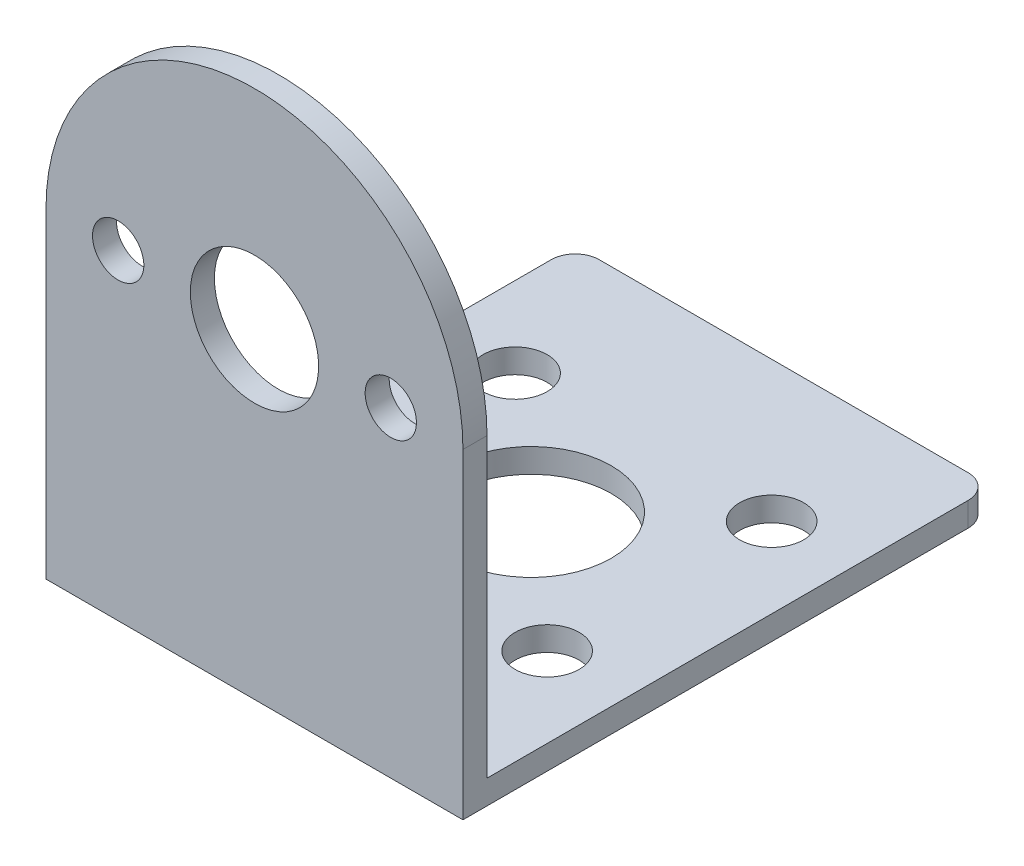
ISO-10303-21;
HEADER;
FILE_DESCRIPTION(('STEP AP214'),'2;1');
FILE_NAME('part.step','',(''),(''),'','','');
FILE_SCHEMA(('AUTOMOTIVE_DESIGN { 1 0 10303 214 1 1 1 1 }'));
ENDSEC;
DATA;
#1=APPLICATION_CONTEXT('core data for automotive mechanical design processes');
#2=APPLICATION_PROTOCOL_DEFINITION('international standard','automotive_design',2000,#1);
#3=PRODUCT_CONTEXT('',#1,'mechanical');
#4=PRODUCT('Part','Part','',(#3));
#5=PRODUCT_RELATED_PRODUCT_CATEGORY('part','',(#4));
#6=PRODUCT_DEFINITION_FORMATION('','',#4);
#7=PRODUCT_DEFINITION_CONTEXT('part definition',#1,'design');
#8=PRODUCT_DEFINITION('design','',#6,#7);
#9=PRODUCT_DEFINITION_SHAPE('','',#8);
#10=(LENGTH_UNIT() NAMED_UNIT(*) SI_UNIT(.MILLI.,.METRE.));
#11=(NAMED_UNIT(*) PLANE_ANGLE_UNIT() SI_UNIT($,.RADIAN.));
#12=(NAMED_UNIT(*) SI_UNIT($,.STERADIAN.) SOLID_ANGLE_UNIT());
#13=UNCERTAINTY_MEASURE_WITH_UNIT(LENGTH_MEASURE(1.E-05),#10,'distance_accuracy_value','');
#14=(GEOMETRIC_REPRESENTATION_CONTEXT(3) GLOBAL_UNCERTAINTY_ASSIGNED_CONTEXT((#13)) GLOBAL_UNIT_ASSIGNED_CONTEXT((#10,
#11,#12)) REPRESENTATION_CONTEXT('',''));
#15=CARTESIAN_POINT('',(0.,0.,0.));
#16=DIRECTION('',(0.,0.,1.));
#17=DIRECTION('',(1.,0.,0.));
#18=AXIS2_PLACEMENT_3D('',#15,#16,#17);
#19=CARTESIAN_POINT('',(13.,20.,0.));
#20=DIRECTION('',(0.,0.,1.));
#21=DIRECTION('',(1.,0.,0.));
#22=AXIS2_PLACEMENT_3D('',#19,#20,#21);
#23=PLANE('',#22);
#24=CARTESIAN_POINT('',(13.,20.,0.));
#25=DIRECTION('',(0.,0.,-1.));
#26=DIRECTION('',(-1.,0.,0.));
#27=AXIS2_PLACEMENT_3D('',#24,#25,#26);
#28=CIRCLE('',#27,4.);
#29=CARTESIAN_POINT('',(9.,20.,0.));
#30=VERTEX_POINT('',#29);
#31=EDGE_CURVE('E132',#30,#30,#28,.T.);
#32=ORIENTED_EDGE('',*,*,#31,.F.);
#33=EDGE_LOOP('',(#32));
#34=FACE_BOUND('',#33,.T.);
#35=CARTESIAN_POINT('',(4.5,20.,0.));
#36=DIRECTION('',(0.,0.,-1.));
#37=DIRECTION('',(-1.,0.,0.));
#38=AXIS2_PLACEMENT_3D('',#35,#36,#37);
#39=CIRCLE('',#38,1.6);
#40=CARTESIAN_POINT('',(2.9,20.,0.));
#41=VERTEX_POINT('',#40);
#42=EDGE_CURVE('E142',#41,#41,#39,.T.);
#43=ORIENTED_EDGE('',*,*,#42,.F.);
#44=EDGE_LOOP('',(#43));
#45=FACE_BOUND('',#44,.T.);
#46=CARTESIAN_POINT('',(21.5,20.,0.));
#47=DIRECTION('',(0.,0.,-1.));
#48=DIRECTION('',(-1.,0.,0.));
#49=AXIS2_PLACEMENT_3D('',#46,#47,#48);
#50=CIRCLE('',#49,1.6);
#51=CARTESIAN_POINT('',(19.9,20.,0.));
#52=VERTEX_POINT('',#51);
#53=EDGE_CURVE('E136',#52,#52,#50,.T.);
#54=ORIENTED_EDGE('',*,*,#53,.F.);
#55=EDGE_LOOP('',(#54));
#56=FACE_BOUND('',#55,.T.);
#57=DIRECTION('',(1.,0.,0.));
#58=VECTOR('',#57,1.);
#59=CARTESIAN_POINT('',(26.,1.5,0.));
#60=LINE('',#59,#58);
#61=CARTESIAN_POINT('',(0.,1.5,0.));
#62=VERTEX_POINT('',#61);
#63=CARTESIAN_POINT('',(26.,1.5,0.));
#64=VERTEX_POINT('',#63);
#65=EDGE_CURVE('E115',#62,#64,#60,.T.);
#66=ORIENTED_EDGE('',*,*,#65,.F.);
#67=DIRECTION('',(0.,-1.,0.));
#68=VECTOR('',#67,1.);
#69=CARTESIAN_POINT('',(0.,0.,0.));
#70=LINE('',#69,#68);
#71=CARTESIAN_POINT('',(0.,20.,0.));
#72=VERTEX_POINT('',#71);
#73=EDGE_CURVE('E118',#72,#62,#70,.T.);
#74=ORIENTED_EDGE('',*,*,#73,.F.);
#75=CARTESIAN_POINT('',(13.,20.,0.));
#76=DIRECTION('',(0.,0.,1.));
#77=DIRECTION('',(1.,0.,0.));
#78=AXIS2_PLACEMENT_3D('',#75,#76,#77);
#79=CIRCLE('',#78,13.);
#80=CARTESIAN_POINT('',(26.,20.,0.));
#81=VERTEX_POINT('',#80);
#82=EDGE_CURVE('E117',#81,#72,#79,.T.);
#83=ORIENTED_EDGE('',*,*,#82,.F.);
#84=DIRECTION('',(0.,1.,0.));
#85=VECTOR('',#84,1.);
#86=CARTESIAN_POINT('',(26.,0.,0.));
#87=LINE('',#86,#85);
#88=EDGE_CURVE('E104',#64,#81,#87,.T.);
#89=ORIENTED_EDGE('',*,*,#88,.F.);
#90=EDGE_LOOP('',(#66,#74,#83,#89));
#91=FACE_BOUND('',#90,.T.);
#92=ADVANCED_FACE('F38',(#34,#45,#56,#91),#23,.F.);
#93=CARTESIAN_POINT('',(0.,0.,1.5));
#94=DIRECTION('',(1.,0.,0.));
#95=DIRECTION('',(0.,0.,-1.));
#96=AXIS2_PLACEMENT_3D('',#93,#94,#95);
#97=PLANE('',#96);
#98=DIRECTION('',(0.,0.,1.));
#99=VECTOR('',#98,1.);
#100=CARTESIAN_POINT('',(0.,1.5,-31.5));
#101=LINE('',#100,#99);
#102=CARTESIAN_POINT('',(0.,1.5,-30.));
#103=VERTEX_POINT('',#102);
#104=EDGE_CURVE('E108',#103,#62,#101,.T.);
#105=ORIENTED_EDGE('',*,*,#104,.F.);
#106=DIRECTION('',(0.,1.,0.));
#107=VECTOR('',#106,1.);
#108=CARTESIAN_POINT('',(0.,0.,-30.));
#109=LINE('',#108,#107);
#110=CARTESIAN_POINT('',(0.,0.,-30.));
#111=VERTEX_POINT('',#110);
#112=EDGE_CURVE('E11',#103,#111,#109,.F.);
#113=ORIENTED_EDGE('',*,*,#112,.T.);
#114=DIRECTION('',(0.,0.,-1.));
#115=VECTOR('',#114,1.);
#116=CARTESIAN_POINT('',(0.,0.,1.5));
#117=LINE('',#116,#115);
#118=CARTESIAN_POINT('',(0.,0.,1.5));
#119=VERTEX_POINT('',#118);
#120=EDGE_CURVE('E168',#119,#111,#117,.T.);
#121=ORIENTED_EDGE('',*,*,#120,.F.);
#122=DIRECTION('',(0.,-1.,0.));
#123=VECTOR('',#122,1.);
#124=CARTESIAN_POINT('',(0.,0.,1.5));
#125=LINE('',#124,#123);
#126=CARTESIAN_POINT('',(0.,20.,1.5));
#127=VERTEX_POINT('',#126);
#128=EDGE_CURVE('E150',#127,#119,#125,.T.);
#129=ORIENTED_EDGE('',*,*,#128,.F.);
#130=DIRECTION('',(0.,0.,-1.));
#131=VECTOR('',#130,1.);
#132=CARTESIAN_POINT('',(0.,20.,1.5));
#133=LINE('',#132,#131);
#134=EDGE_CURVE('E159',#127,#72,#133,.T.);
#135=ORIENTED_EDGE('',*,*,#134,.T.);
#136=ORIENTED_EDGE('',*,*,#73,.T.);
#137=EDGE_LOOP('',(#105,#113,#121,#129,#135,#136));
#138=FACE_BOUND('',#137,.T.);
#139=ADVANCED_FACE('F216',(#138),#97,.F.);
#140=CARTESIAN_POINT('',(0.,0.,1.5));
#141=DIRECTION('',(0.,1.,0.));
#142=DIRECTION('',(0.,0.,1.));
#143=AXIS2_PLACEMENT_3D('',#140,#141,#142);
#144=PLANE('',#143);
#145=CARTESIAN_POINT('',(5.,0.,-22.75));
#146=DIRECTION('',(0.,-1.,0.));
#147=DIRECTION('',(0.,0.,1.));
#148=AXIS2_PLACEMENT_3D('',#145,#146,#147);
#149=CIRCLE('',#148,2.);
#150=CARTESIAN_POINT('',(5.,0.,-20.75));
#151=VERTEX_POINT('',#150);
#152=EDGE_CURVE('E296',#151,#151,#149,.T.);
#153=ORIENTED_EDGE('',*,*,#152,.F.);
#154=EDGE_LOOP('',(#153));
#155=FACE_BOUND('',#154,.T.);
#156=CARTESIAN_POINT('',(13.,0.,-15.75));
#157=DIRECTION('',(0.,-1.,0.));
#158=DIRECTION('',(0.,0.,-1.));
#159=AXIS2_PLACEMENT_3D('',#156,#157,#158);
#160=CIRCLE('',#159,5.);
#161=CARTESIAN_POINT('',(13.,0.,-20.75));
#162=VERTEX_POINT('',#161);
#163=EDGE_CURVE('E291',#162,#162,#160,.T.);
#164=ORIENTED_EDGE('',*,*,#163,.F.);
#165=EDGE_LOOP('',(#164));
#166=FACE_BOUND('',#165,.T.);
#167=CARTESIAN_POINT('',(21.,0.,-22.75));
#168=DIRECTION('',(0.,-1.,0.));
#169=DIRECTION('',(0.,0.,1.));
#170=AXIS2_PLACEMENT_3D('',#167,#168,#169);
#171=CIRCLE('',#170,2.);
#172=CARTESIAN_POINT('',(21.,0.,-20.75));
#173=VERTEX_POINT('',#172);
#174=EDGE_CURVE('E286',#173,#173,#171,.T.);
#175=ORIENTED_EDGE('',*,*,#174,.F.);
#176=EDGE_LOOP('',(#175));
#177=FACE_BOUND('',#176,.T.);
#178=CARTESIAN_POINT('',(21.,0.,-8.75));
#179=DIRECTION('',(0.,-1.,0.));
#180=DIRECTION('',(0.,0.,-1.));
#181=AXIS2_PLACEMENT_3D('',#178,#179,#180);
#182=CIRCLE('',#181,2.);
#183=CARTESIAN_POINT('',(21.,0.,-10.75));
#184=VERTEX_POINT('',#183);
#185=EDGE_CURVE('E279',#184,#184,#182,.T.);
#186=ORIENTED_EDGE('',*,*,#185,.F.);
#187=EDGE_LOOP('',(#186));
#188=FACE_BOUND('',#187,.T.);
#189=CARTESIAN_POINT('',(5.,0.,-8.75));
#190=DIRECTION('',(0.,-1.,0.));
#191=DIRECTION('',(0.,0.,-1.));
#192=AXIS2_PLACEMENT_3D('',#189,#190,#191);
#193=CIRCLE('',#192,2.);
#194=CARTESIAN_POINT('',(5.,0.,-10.75));
#195=VERTEX_POINT('',#194);
#196=EDGE_CURVE('E176',#195,#195,#193,.T.);
#197=ORIENTED_EDGE('',*,*,#196,.F.);
#198=EDGE_LOOP('',(#197));
#199=FACE_BOUND('',#198,.T.);
#200=DIRECTION('',(-1.,0.,0.));
#201=VECTOR('',#200,1.);
#202=CARTESIAN_POINT('',(26.,0.,-31.5));
#203=LINE('',#202,#201);
#204=CARTESIAN_POINT('',(24.5,0.,-31.5));
#205=VERTEX_POINT('',#204);
#206=CARTESIAN_POINT('',(1.5,0.,-31.5));
#207=VERTEX_POINT('',#206);
#208=EDGE_CURVE('E121',#205,#207,#203,.T.);
#209=ORIENTED_EDGE('',*,*,#208,.F.);
#210=CARTESIAN_POINT('',(24.5,0.,-30.));
#211=DIRECTION('',(0.,1.,0.));
#212=DIRECTION('',(0.,0.,1.));
#213=AXIS2_PLACEMENT_3D('',#210,#211,#212);
#214=CIRCLE('',#213,1.5);
#215=CARTESIAN_POINT('',(26.,0.,-30.));
#216=VERTEX_POINT('',#215);
#217=EDGE_CURVE('E191',#205,#216,#214,.F.);
#218=ORIENTED_EDGE('',*,*,#217,.T.);
#219=DIRECTION('',(0.,0.,-1.));
#220=VECTOR('',#219,1.);
#221=CARTESIAN_POINT('',(26.,0.,1.5));
#222=LINE('',#221,#220);
#223=CARTESIAN_POINT('',(26.,0.,1.5));
#224=VERTEX_POINT('',#223);
#225=EDGE_CURVE('E166',#224,#216,#222,.T.);
#226=ORIENTED_EDGE('',*,*,#225,.F.);
#227=DIRECTION('',(1.,0.,0.));
#228=VECTOR('',#227,1.);
#229=CARTESIAN_POINT('',(0.,0.,1.5));
#230=LINE('',#229,#228);
#231=EDGE_CURVE('E153',#119,#224,#230,.T.);
#232=ORIENTED_EDGE('',*,*,#231,.F.);
#233=ORIENTED_EDGE('',*,*,#120,.T.);
#234=CARTESIAN_POINT('',(1.5,0.,-30.));
#235=DIRECTION('',(0.,1.,0.));
#236=DIRECTION('',(0.,0.,1.));
#237=AXIS2_PLACEMENT_3D('',#234,#235,#236);
#238=CIRCLE('',#237,1.5);
#239=EDGE_CURVE('E189',#111,#207,#238,.F.);
#240=ORIENTED_EDGE('',*,*,#239,.T.);
#241=EDGE_LOOP('',(#209,#218,#226,#232,#233,#240));
#242=FACE_BOUND('',#241,.T.);
#243=ADVANCED_FACE('F204',(#155,#166,#177,#188,#199,#242),#144,.F.);
#244=CARTESIAN_POINT('',(26.,0.,1.5));
#245=DIRECTION('',(-1.,0.,0.));
#246=DIRECTION('',(0.,0.,1.));
#247=AXIS2_PLACEMENT_3D('',#244,#245,#246);
#248=PLANE('',#247);
#249=ORIENTED_EDGE('',*,*,#225,.T.);
#250=DIRECTION('',(0.,-1.,0.));
#251=VECTOR('',#250,1.);
#252=CARTESIAN_POINT('',(26.,0.,-30.));
#253=LINE('',#252,#251);
#254=CARTESIAN_POINT('',(26.,1.5,-30.));
#255=VERTEX_POINT('',#254);
#256=EDGE_CURVE('E61',#216,#255,#253,.F.);
#257=ORIENTED_EDGE('',*,*,#256,.T.);
#258=DIRECTION('',(0.,0.,1.));
#259=VECTOR('',#258,1.);
#260=CARTESIAN_POINT('',(26.,1.5,-31.5));
#261=LINE('',#260,#259);
#262=EDGE_CURVE('E100',#255,#64,#261,.T.);
#263=ORIENTED_EDGE('',*,*,#262,.T.);
#264=ORIENTED_EDGE('',*,*,#88,.T.);
#265=DIRECTION('',(0.,0.,-1.));
#266=VECTOR('',#265,1.);
#267=CARTESIAN_POINT('',(26.,20.,1.5));
#268=LINE('',#267,#266);
#269=CARTESIAN_POINT('',(26.,20.,1.5));
#270=VERTEX_POINT('',#269);
#271=EDGE_CURVE('E164',#270,#81,#268,.T.);
#272=ORIENTED_EDGE('',*,*,#271,.F.);
#273=DIRECTION('',(0.,1.,0.));
#274=VECTOR('',#273,1.);
#275=CARTESIAN_POINT('',(26.,0.,1.5));
#276=LINE('',#275,#274);
#277=EDGE_CURVE('E155',#224,#270,#276,.T.);
#278=ORIENTED_EDGE('',*,*,#277,.F.);
#279=EDGE_LOOP('',(#249,#257,#263,#264,#272,#278));
#280=FACE_BOUND('',#279,.T.);
#281=ADVANCED_FACE('F102',(#280),#248,.F.);
#282=CARTESIAN_POINT('',(13.,20.,1.5));
#283=DIRECTION('',(0.,0.,-1.));
#284=DIRECTION('',(-1.,0.,0.));
#285=AXIS2_PLACEMENT_3D('',#282,#283,#284);
#286=CYLINDRICAL_SURFACE('',#285,13.);
#287=ORIENTED_EDGE('',*,*,#82,.T.);
#288=ORIENTED_EDGE('',*,*,#134,.F.);
#289=CARTESIAN_POINT('',(13.,20.,1.5));
#290=DIRECTION('',(0.,0.,1.));
#291=DIRECTION('',(1.,0.,0.));
#292=AXIS2_PLACEMENT_3D('',#289,#290,#291);
#293=CIRCLE('',#292,13.);
#294=EDGE_CURVE('E157',#270,#127,#293,.T.);
#295=ORIENTED_EDGE('',*,*,#294,.F.);
#296=ORIENTED_EDGE('',*,*,#271,.T.);
#297=EDGE_LOOP('',(#287,#288,#295,#296));
#298=FACE_BOUND('',#297,.T.);
#299=ADVANCED_FACE('F218',(#298),#286,.T.);
#300=CARTESIAN_POINT('',(13.,20.,1.5));
#301=DIRECTION('',(0.,0.,1.));
#302=DIRECTION('',(1.,0.,0.));
#303=AXIS2_PLACEMENT_3D('',#300,#301,#302);
#304=PLANE('',#303);
#305=CARTESIAN_POINT('',(21.5,20.,1.5));
#306=DIRECTION('',(0.,0.,-1.));
#307=DIRECTION('',(-1.,0.,0.));
#308=AXIS2_PLACEMENT_3D('',#305,#306,#307);
#309=CIRCLE('',#308,1.6);
#310=CARTESIAN_POINT('',(19.9,20.,1.5));
#311=VERTEX_POINT('',#310);
#312=EDGE_CURVE('E133',#311,#311,#309,.T.);
#313=ORIENTED_EDGE('',*,*,#312,.T.);
#314=EDGE_LOOP('',(#313));
#315=FACE_BOUND('',#314,.T.);
#316=CARTESIAN_POINT('',(4.5,20.,1.5));
#317=DIRECTION('',(0.,0.,-1.));
#318=DIRECTION('',(-1.,0.,0.));
#319=AXIS2_PLACEMENT_3D('',#316,#317,#318);
#320=CIRCLE('',#319,1.6);
#321=CARTESIAN_POINT('',(2.9,20.,1.5));
#322=VERTEX_POINT('',#321);
#323=EDGE_CURVE('E139',#322,#322,#320,.T.);
#324=ORIENTED_EDGE('',*,*,#323,.T.);
#325=EDGE_LOOP('',(#324));
#326=FACE_BOUND('',#325,.T.);
#327=CARTESIAN_POINT('',(13.,20.,1.5));
#328=DIRECTION('',(0.,0.,-1.));
#329=DIRECTION('',(-1.,0.,0.));
#330=AXIS2_PLACEMENT_3D('',#327,#328,#329);
#331=CIRCLE('',#330,4.);
#332=CARTESIAN_POINT('',(9.,20.,1.5));
#333=VERTEX_POINT('',#332);
#334=EDGE_CURVE('E145',#333,#333,#331,.T.);
#335=ORIENTED_EDGE('',*,*,#334,.T.);
#336=EDGE_LOOP('',(#335));
#337=FACE_BOUND('',#336,.T.);
#338=ORIENTED_EDGE('',*,*,#128,.T.);
#339=ORIENTED_EDGE('',*,*,#231,.T.);
#340=ORIENTED_EDGE('',*,*,#277,.T.);
#341=ORIENTED_EDGE('',*,*,#294,.T.);
#342=EDGE_LOOP('',(#338,#339,#340,#341));
#343=FACE_BOUND('',#342,.T.);
#344=ADVANCED_FACE('F208',(#315,#326,#337,#343),#304,.T.);
#345=CARTESIAN_POINT('',(13.,20.,1.5));
#346=DIRECTION('',(0.,0.,-1.));
#347=DIRECTION('',(-1.,0.,0.));
#348=AXIS2_PLACEMENT_3D('',#345,#346,#347);
#349=CYLINDRICAL_SURFACE('',#348,4.);
#350=ORIENTED_EDGE('',*,*,#334,.F.);
#351=EDGE_LOOP('',(#350));
#352=FACE_BOUND('',#351,.T.);
#353=ORIENTED_EDGE('',*,*,#31,.T.);
#354=EDGE_LOOP('',(#353));
#355=FACE_BOUND('',#354,.T.);
#356=ADVANCED_FACE('F225',(#352,#355),#349,.F.);
#357=CARTESIAN_POINT('',(4.5,20.,1.5));
#358=DIRECTION('',(0.,0.,-1.));
#359=DIRECTION('',(-1.,0.,0.));
#360=AXIS2_PLACEMENT_3D('',#357,#358,#359);
#361=CYLINDRICAL_SURFACE('',#360,1.6);
#362=ORIENTED_EDGE('',*,*,#323,.F.);
#363=EDGE_LOOP('',(#362));
#364=FACE_BOUND('',#363,.T.);
#365=ORIENTED_EDGE('',*,*,#42,.T.);
#366=EDGE_LOOP('',(#365));
#367=FACE_BOUND('',#366,.T.);
#368=ADVANCED_FACE('F241',(#364,#367),#361,.F.);
#369=CARTESIAN_POINT('',(21.5,20.,1.5));
#370=DIRECTION('',(0.,0.,-1.));
#371=DIRECTION('',(-1.,0.,0.));
#372=AXIS2_PLACEMENT_3D('',#369,#370,#371);
#373=CYLINDRICAL_SURFACE('',#372,1.6);
#374=ORIENTED_EDGE('',*,*,#312,.F.);
#375=EDGE_LOOP('',(#374));
#376=FACE_BOUND('',#375,.T.);
#377=ORIENTED_EDGE('',*,*,#53,.T.);
#378=EDGE_LOOP('',(#377));
#379=FACE_BOUND('',#378,.T.);
#380=ADVANCED_FACE('F245',(#376,#379),#373,.F.);
#381=CARTESIAN_POINT('',(26.,1.5,-31.5));
#382=DIRECTION('',(0.,-1.,0.));
#383=DIRECTION('',(1.,0.,0.));
#384=AXIS2_PLACEMENT_3D('',#381,#382,#383);
#385=PLANE('',#384);
#386=CARTESIAN_POINT('',(5.,1.5,-22.75));
#387=DIRECTION('',(0.,-1.,0.));
#388=DIRECTION('',(1.,0.,0.));
#389=AXIS2_PLACEMENT_3D('',#386,#387,#388);
#390=CIRCLE('',#389,2.);
#391=CARTESIAN_POINT('',(7.,1.5,-22.75));
#392=VERTEX_POINT('',#391);
#393=EDGE_CURVE('E122',#392,#392,#390,.T.);
#394=ORIENTED_EDGE('',*,*,#393,.T.);
#395=EDGE_LOOP('',(#394));
#396=FACE_BOUND('',#395,.T.);
#397=CARTESIAN_POINT('',(13.,1.5,-15.75));
#398=DIRECTION('',(0.,-1.,0.));
#399=DIRECTION('',(1.,0.,0.));
#400=AXIS2_PLACEMENT_3D('',#397,#398,#399);
#401=CIRCLE('',#400,5.);
#402=CARTESIAN_POINT('',(18.,1.5,-15.75));
#403=VERTEX_POINT('',#402);
#404=EDGE_CURVE('E127',#403,#403,#401,.T.);
#405=ORIENTED_EDGE('',*,*,#404,.T.);
#406=EDGE_LOOP('',(#405));
#407=FACE_BOUND('',#406,.T.);
#408=CARTESIAN_POINT('',(21.,1.5,-22.75));
#409=DIRECTION('',(0.,-1.,0.));
#410=DIRECTION('',(1.,0.,0.));
#411=AXIS2_PLACEMENT_3D('',#408,#409,#410);
#412=CIRCLE('',#411,2.);
#413=CARTESIAN_POINT('',(23.,1.5,-22.75));
#414=VERTEX_POINT('',#413);
#415=EDGE_CURVE('E179',#414,#414,#412,.T.);
#416=ORIENTED_EDGE('',*,*,#415,.T.);
#417=EDGE_LOOP('',(#416));
#418=FACE_BOUND('',#417,.T.);
#419=CARTESIAN_POINT('',(21.,1.5,-8.75));
#420=DIRECTION('',(0.,-1.,0.));
#421=DIRECTION('',(1.,0.,0.));
#422=AXIS2_PLACEMENT_3D('',#419,#420,#421);
#423=CIRCLE('',#422,2.);
#424=CARTESIAN_POINT('',(23.,1.5,-8.75));
#425=VERTEX_POINT('',#424);
#426=EDGE_CURVE('E175',#425,#425,#423,.T.);
#427=ORIENTED_EDGE('',*,*,#426,.T.);
#428=EDGE_LOOP('',(#427));
#429=FACE_BOUND('',#428,.T.);
#430=CARTESIAN_POINT('',(5.,1.5,-8.75));
#431=DIRECTION('',(0.,-1.,0.));
#432=DIRECTION('',(1.,0.,0.));
#433=AXIS2_PLACEMENT_3D('',#430,#431,#432);
#434=CIRCLE('',#433,2.);
#435=CARTESIAN_POINT('',(7.,1.5,-8.75));
#436=VERTEX_POINT('',#435);
#437=EDGE_CURVE('E172',#436,#436,#434,.T.);
#438=ORIENTED_EDGE('',*,*,#437,.T.);
#439=EDGE_LOOP('',(#438));
#440=FACE_BOUND('',#439,.T.);
#441=ORIENTED_EDGE('',*,*,#262,.F.);
#442=CARTESIAN_POINT('',(24.5,1.5,-30.));
#443=DIRECTION('',(0.,-1.,0.));
#444=DIRECTION('',(1.,0.,0.));
#445=AXIS2_PLACEMENT_3D('',#442,#443,#444);
#446=CIRCLE('',#445,1.5);
#447=CARTESIAN_POINT('',(24.5,1.5,-31.5));
#448=VERTEX_POINT('',#447);
#449=EDGE_CURVE('E46',#255,#448,#446,.F.);
#450=ORIENTED_EDGE('',*,*,#449,.T.);
#451=DIRECTION('',(1.,0.,0.));
#452=VECTOR('',#451,1.);
#453=CARTESIAN_POINT('',(26.,1.5,-31.5));
#454=LINE('',#453,#452);
#455=CARTESIAN_POINT('',(1.5,1.5,-31.5));
#456=VERTEX_POINT('',#455);
#457=EDGE_CURVE('E109',#456,#448,#454,.T.);
#458=ORIENTED_EDGE('',*,*,#457,.F.);
#459=CARTESIAN_POINT('',(1.5,1.5,-30.));
#460=DIRECTION('',(0.,-1.,0.));
#461=DIRECTION('',(1.,0.,0.));
#462=AXIS2_PLACEMENT_3D('',#459,#460,#461);
#463=CIRCLE('',#462,1.5);
#464=EDGE_CURVE('E53',#456,#103,#463,.F.);
#465=ORIENTED_EDGE('',*,*,#464,.T.);
#466=ORIENTED_EDGE('',*,*,#104,.T.);
#467=ORIENTED_EDGE('',*,*,#65,.T.);
#468=EDGE_LOOP('',(#441,#450,#458,#465,#466,#467));
#469=FACE_BOUND('',#468,.T.);
#470=ADVANCED_FACE('F120',(#396,#407,#418,#429,#440,#469),#385,.F.);
#471=CARTESIAN_POINT('',(0.,0.,-31.5));
#472=DIRECTION('',(0.,0.,1.));
#473=DIRECTION('',(1.,0.,0.));
#474=AXIS2_PLACEMENT_3D('',#471,#472,#473);
#475=PLANE('',#474);
#476=ORIENTED_EDGE('',*,*,#457,.T.);
#477=DIRECTION('',(0.,-1.,0.));
#478=VECTOR('',#477,1.);
#479=CARTESIAN_POINT('',(24.5,0.,-31.5));
#480=LINE('',#479,#478);
#481=EDGE_CURVE('E186',#448,#205,#480,.T.);
#482=ORIENTED_EDGE('',*,*,#481,.T.);
#483=ORIENTED_EDGE('',*,*,#208,.T.);
#484=DIRECTION('',(0.,1.,0.));
#485=VECTOR('',#484,1.);
#486=CARTESIAN_POINT('',(1.5,0.,-31.5));
#487=LINE('',#486,#485);
#488=EDGE_CURVE('E171',#207,#456,#487,.T.);
#489=ORIENTED_EDGE('',*,*,#488,.T.);
#490=EDGE_LOOP('',(#476,#482,#483,#489));
#491=FACE_BOUND('',#490,.T.);
#492=ADVANCED_FACE('F198',(#491),#475,.F.);
#493=CARTESIAN_POINT('',(5.,33.,-8.75));
#494=DIRECTION('',(0.,-1.,0.));
#495=DIRECTION('',(0.,0.,-1.));
#496=AXIS2_PLACEMENT_3D('',#493,#494,#495);
#497=CYLINDRICAL_SURFACE('',#496,2.);
#498=ORIENTED_EDGE('',*,*,#196,.T.);
#499=EDGE_LOOP('',(#498));
#500=FACE_BOUND('',#499,.T.);
#501=ORIENTED_EDGE('',*,*,#437,.F.);
#502=EDGE_LOOP('',(#501));
#503=FACE_BOUND('',#502,.T.);
#504=ADVANCED_FACE('F255',(#500,#503),#497,.F.);
#505=CARTESIAN_POINT('',(21.,33.,-8.75));
#506=DIRECTION('',(0.,-1.,0.));
#507=DIRECTION('',(0.,0.,-1.));
#508=AXIS2_PLACEMENT_3D('',#505,#506,#507);
#509=CYLINDRICAL_SURFACE('',#508,2.);
#510=ORIENTED_EDGE('',*,*,#185,.T.);
#511=EDGE_LOOP('',(#510));
#512=FACE_BOUND('',#511,.T.);
#513=ORIENTED_EDGE('',*,*,#426,.F.);
#514=EDGE_LOOP('',(#513));
#515=FACE_BOUND('',#514,.T.);
#516=ADVANCED_FACE('F258',(#512,#515),#509,.F.);
#517=CARTESIAN_POINT('',(21.,33.,-22.75));
#518=DIRECTION('',(0.,-1.,0.));
#519=DIRECTION('',(0.,0.,-1.));
#520=AXIS2_PLACEMENT_3D('',#517,#518,#519);
#521=CYLINDRICAL_SURFACE('',#520,2.);
#522=ORIENTED_EDGE('',*,*,#174,.T.);
#523=EDGE_LOOP('',(#522));
#524=FACE_BOUND('',#523,.T.);
#525=ORIENTED_EDGE('',*,*,#415,.F.);
#526=EDGE_LOOP('',(#525));
#527=FACE_BOUND('',#526,.T.);
#528=ADVANCED_FACE('F267',(#524,#527),#521,.F.);
#529=CARTESIAN_POINT('',(13.,33.,-15.75));
#530=DIRECTION('',(0.,-1.,0.));
#531=DIRECTION('',(0.,0.,-1.));
#532=AXIS2_PLACEMENT_3D('',#529,#530,#531);
#533=CYLINDRICAL_SURFACE('',#532,5.);
#534=ORIENTED_EDGE('',*,*,#163,.T.);
#535=EDGE_LOOP('',(#534));
#536=FACE_BOUND('',#535,.T.);
#537=ORIENTED_EDGE('',*,*,#404,.F.);
#538=EDGE_LOOP('',(#537));
#539=FACE_BOUND('',#538,.T.);
#540=ADVANCED_FACE('F263',(#536,#539),#533,.F.);
#541=CARTESIAN_POINT('',(5.,33.,-22.75));
#542=DIRECTION('',(0.,-1.,0.));
#543=DIRECTION('',(0.,0.,-1.));
#544=AXIS2_PLACEMENT_3D('',#541,#542,#543);
#545=CYLINDRICAL_SURFACE('',#544,2.);
#546=ORIENTED_EDGE('',*,*,#152,.T.);
#547=EDGE_LOOP('',(#546));
#548=FACE_BOUND('',#547,.T.);
#549=ORIENTED_EDGE('',*,*,#393,.F.);
#550=EDGE_LOOP('',(#549));
#551=FACE_BOUND('',#550,.T.);
#552=ADVANCED_FACE('F260',(#548,#551),#545,.F.);
#553=CARTESIAN_POINT('',(24.5,0.,-30.));
#554=DIRECTION('',(0.,-1.,0.));
#555=DIRECTION('',(0.,0.,-1.));
#556=AXIS2_PLACEMENT_3D('',#553,#554,#555);
#557=CYLINDRICAL_SURFACE('',#556,1.5);
#558=ORIENTED_EDGE('',*,*,#449,.F.);
#559=ORIENTED_EDGE('',*,*,#256,.F.);
#560=ORIENTED_EDGE('',*,*,#217,.F.);
#561=ORIENTED_EDGE('',*,*,#481,.F.);
#562=EDGE_LOOP('',(#558,#559,#560,#561));
#563=FACE_BOUND('',#562,.T.);
#564=ADVANCED_FACE('F201',(#563),#557,.T.);
#565=CARTESIAN_POINT('',(1.5,0.,-30.));
#566=DIRECTION('',(0.,1.,0.));
#567=DIRECTION('',(0.,0.,1.));
#568=AXIS2_PLACEMENT_3D('',#565,#566,#567);
#569=CYLINDRICAL_SURFACE('',#568,1.5);
#570=ORIENTED_EDGE('',*,*,#239,.F.);
#571=ORIENTED_EDGE('',*,*,#112,.F.);
#572=ORIENTED_EDGE('',*,*,#464,.F.);
#573=ORIENTED_EDGE('',*,*,#488,.F.);
#574=EDGE_LOOP('',(#570,#571,#572,#573));
#575=FACE_BOUND('',#574,.T.);
#576=ADVANCED_FACE('F40',(#575),#569,.T.);
#577=CLOSED_SHELL('',(#92,#139,#243,#281,#299,#344,#356,#368,#380,#470,#492,#504,#516,#528,#540,
#552,#564,#576));
#578=MANIFOLD_SOLID_BREP('B2',#577);
#579=ADVANCED_BREP_SHAPE_REPRESENTATION('',(#18,#578),#14);
#580=SHAPE_DEFINITION_REPRESENTATION(#9,#579);
ENDSEC;
END-ISO-10303-21;
